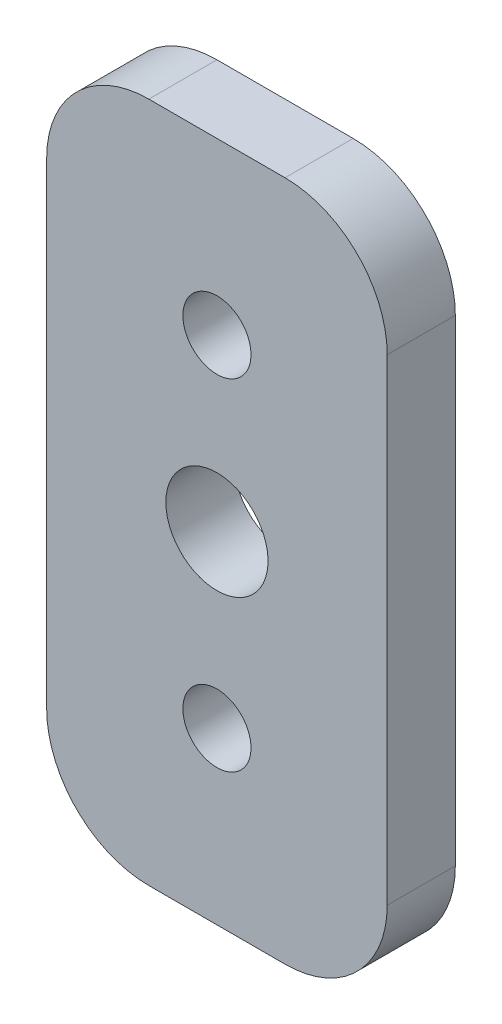
ISO-10303-21;
HEADER;
FILE_DESCRIPTION(('STEP AP214'),'2;1');
FILE_NAME('part.step','',(''),(''),'','','');
FILE_SCHEMA(('AUTOMOTIVE_DESIGN { 1 0 10303 214 1 1 1 1 }'));
ENDSEC;
DATA;
#1=APPLICATION_CONTEXT('core data for automotive mechanical design processes');
#2=APPLICATION_PROTOCOL_DEFINITION('international standard','automotive_design',2000,#1);
#3=PRODUCT_CONTEXT('',#1,'mechanical');
#4=PRODUCT('Part','Part','',(#3));
#5=PRODUCT_RELATED_PRODUCT_CATEGORY('part','',(#4));
#6=PRODUCT_DEFINITION_FORMATION('','',#4);
#7=PRODUCT_DEFINITION_CONTEXT('part definition',#1,'design');
#8=PRODUCT_DEFINITION('design','',#6,#7);
#9=PRODUCT_DEFINITION_SHAPE('','',#8);
#10=(LENGTH_UNIT() NAMED_UNIT(*) SI_UNIT(.MILLI.,.METRE.));
#11=(NAMED_UNIT(*) PLANE_ANGLE_UNIT() SI_UNIT($,.RADIAN.));
#12=(NAMED_UNIT(*) SI_UNIT($,.STERADIAN.) SOLID_ANGLE_UNIT());
#13=UNCERTAINTY_MEASURE_WITH_UNIT(LENGTH_MEASURE(1.E-05),#10,'distance_accuracy_value','');
#14=(GEOMETRIC_REPRESENTATION_CONTEXT(3) GLOBAL_UNCERTAINTY_ASSIGNED_CONTEXT((#13)) GLOBAL_UNIT_ASSIGNED_CONTEXT((#10,
#11,#12)) REPRESENTATION_CONTEXT('',''));
#15=CARTESIAN_POINT('',(0.,0.,0.));
#16=DIRECTION('',(0.,0.,1.));
#17=DIRECTION('',(1.,0.,0.));
#18=AXIS2_PLACEMENT_3D('',#15,#16,#17);
#19=CARTESIAN_POINT('',(-25.,-50.,10.));
#20=DIRECTION('',(1.,0.,0.));
#21=DIRECTION('',(0.,0.,-1.));
#22=AXIS2_PLACEMENT_3D('',#19,#20,#21);
#23=PLANE('',#22);
#24=DIRECTION('',(0.,-1.,0.));
#25=VECTOR('',#24,1.);
#26=CARTESIAN_POINT('',(-25.,-50.,0.));
#27=LINE('',#26,#25);
#28=CARTESIAN_POINT('',(-25.,35.,0.));
#29=VERTEX_POINT('',#28);
#30=CARTESIAN_POINT('',(-25.,-35.,0.));
#31=VERTEX_POINT('',#30);
#32=EDGE_CURVE('E136',#29,#31,#27,.T.);
#33=ORIENTED_EDGE('',*,*,#32,.T.);
#34=DIRECTION('',(0.,0.,-1.));
#35=VECTOR('',#34,1.);
#36=CARTESIAN_POINT('',(-25.,-35.,10.));
#37=LINE('',#36,#35);
#38=CARTESIAN_POINT('',(-25.,-35.,10.));
#39=VERTEX_POINT('',#38);
#40=EDGE_CURVE('E111',#31,#39,#37,.F.);
#41=ORIENTED_EDGE('',*,*,#40,.T.);
#42=DIRECTION('',(0.,-1.,0.));
#43=VECTOR('',#42,1.);
#44=CARTESIAN_POINT('',(-25.,-50.,10.));
#45=LINE('',#44,#43);
#46=CARTESIAN_POINT('',(-25.,35.,10.));
#47=VERTEX_POINT('',#46);
#48=EDGE_CURVE('E149',#47,#39,#45,.T.);
#49=ORIENTED_EDGE('',*,*,#48,.F.);
#50=DIRECTION('',(0.,0.,-1.));
#51=VECTOR('',#50,1.);
#52=CARTESIAN_POINT('',(-25.,35.,10.));
#53=LINE('',#52,#51);
#54=EDGE_CURVE('E117',#47,#29,#53,.T.);
#55=ORIENTED_EDGE('',*,*,#54,.T.);
#56=EDGE_LOOP('',(#33,#41,#49,#55));
#57=FACE_BOUND('',#56,.T.);
#58=ADVANCED_FACE('F39',(#57),#23,.F.);
#59=CARTESIAN_POINT('',(-25.,-50.,10.));
#60=DIRECTION('',(0.,1.,0.));
#61=DIRECTION('',(0.,0.,1.));
#62=AXIS2_PLACEMENT_3D('',#59,#60,#61);
#63=PLANE('',#62);
#64=DIRECTION('',(1.,0.,0.));
#65=VECTOR('',#64,1.);
#66=CARTESIAN_POINT('',(-25.,-50.,10.));
#67=LINE('',#66,#65);
#68=CARTESIAN_POINT('',(-10.,-50.,10.));
#69=VERTEX_POINT('',#68);
#70=CARTESIAN_POINT('',(10.,-50.,10.));
#71=VERTEX_POINT('',#70);
#72=EDGE_CURVE('E127',#69,#71,#67,.T.);
#73=ORIENTED_EDGE('',*,*,#72,.F.);
#74=DIRECTION('',(0.,0.,-1.));
#75=VECTOR('',#74,1.);
#76=CARTESIAN_POINT('',(-10.,-50.,10.));
#77=LINE('',#76,#75);
#78=CARTESIAN_POINT('',(-10.,-50.,0.));
#79=VERTEX_POINT('',#78);
#80=EDGE_CURVE('E110',#69,#79,#77,.T.);
#81=ORIENTED_EDGE('',*,*,#80,.T.);
#82=DIRECTION('',(1.,0.,0.));
#83=VECTOR('',#82,1.);
#84=CARTESIAN_POINT('',(-25.,-50.,0.));
#85=LINE('',#84,#83);
#86=CARTESIAN_POINT('',(10.,-50.,0.));
#87=VERTEX_POINT('',#86);
#88=EDGE_CURVE('E124',#79,#87,#85,.T.);
#89=ORIENTED_EDGE('',*,*,#88,.T.);
#90=DIRECTION('',(0.,0.,-1.));
#91=VECTOR('',#90,1.);
#92=CARTESIAN_POINT('',(10.,-50.,10.));
#93=LINE('',#92,#91);
#94=EDGE_CURVE('E130',#87,#71,#93,.F.);
#95=ORIENTED_EDGE('',*,*,#94,.T.);
#96=EDGE_LOOP('',(#73,#81,#89,#95));
#97=FACE_BOUND('',#96,.T.);
#98=ADVANCED_FACE('F123',(#97),#63,.F.);
#99=CARTESIAN_POINT('',(25.,-50.,10.));
#100=DIRECTION('',(-1.,0.,0.));
#101=DIRECTION('',(0.,0.,1.));
#102=AXIS2_PLACEMENT_3D('',#99,#100,#101);
#103=PLANE('',#102);
#104=DIRECTION('',(0.,1.,0.));
#105=VECTOR('',#104,1.);
#106=CARTESIAN_POINT('',(25.,-50.,0.));
#107=LINE('',#106,#105);
#108=CARTESIAN_POINT('',(25.,-35.,0.));
#109=VERTEX_POINT('',#108);
#110=CARTESIAN_POINT('',(25.,35.,0.));
#111=VERTEX_POINT('',#110);
#112=EDGE_CURVE('E135',#109,#111,#107,.T.);
#113=ORIENTED_EDGE('',*,*,#112,.T.);
#114=DIRECTION('',(0.,0.,-1.));
#115=VECTOR('',#114,1.);
#116=CARTESIAN_POINT('',(25.,35.,10.));
#117=LINE('',#116,#115);
#118=CARTESIAN_POINT('',(25.,35.,10.));
#119=VERTEX_POINT('',#118);
#120=EDGE_CURVE('E11',#111,#119,#117,.F.);
#121=ORIENTED_EDGE('',*,*,#120,.T.);
#122=DIRECTION('',(0.,1.,0.));
#123=VECTOR('',#122,1.);
#124=CARTESIAN_POINT('',(25.,-50.,10.));
#125=LINE('',#124,#123);
#126=CARTESIAN_POINT('',(25.,-35.,10.));
#127=VERTEX_POINT('',#126);
#128=EDGE_CURVE('E188',#127,#119,#125,.T.);
#129=ORIENTED_EDGE('',*,*,#128,.F.);
#130=DIRECTION('',(0.,0.,-1.));
#131=VECTOR('',#130,1.);
#132=CARTESIAN_POINT('',(25.,-35.,10.));
#133=LINE('',#132,#131);
#134=EDGE_CURVE('E48',#127,#109,#133,.T.);
#135=ORIENTED_EDGE('',*,*,#134,.T.);
#136=EDGE_LOOP('',(#113,#121,#129,#135));
#137=FACE_BOUND('',#136,.T.);
#138=ADVANCED_FACE('F186',(#137),#103,.F.);
#139=CARTESIAN_POINT('',(-25.,50.,10.));
#140=DIRECTION('',(0.,-1.,0.));
#141=DIRECTION('',(0.,0.,-1.));
#142=AXIS2_PLACEMENT_3D('',#139,#140,#141);
#143=PLANE('',#142);
#144=DIRECTION('',(-1.,0.,0.));
#145=VECTOR('',#144,1.);
#146=CARTESIAN_POINT('',(-25.,50.,0.));
#147=LINE('',#146,#145);
#148=CARTESIAN_POINT('',(10.,50.,0.));
#149=VERTEX_POINT('',#148);
#150=CARTESIAN_POINT('',(-10.,50.,0.));
#151=VERTEX_POINT('',#150);
#152=EDGE_CURVE('E141',#149,#151,#147,.T.);
#153=ORIENTED_EDGE('',*,*,#152,.T.);
#154=DIRECTION('',(0.,0.,-1.));
#155=VECTOR('',#154,1.);
#156=CARTESIAN_POINT('',(-10.,50.,10.));
#157=LINE('',#156,#155);
#158=CARTESIAN_POINT('',(-10.,50.,10.));
#159=VERTEX_POINT('',#158);
#160=EDGE_CURVE('E55',#151,#159,#157,.F.);
#161=ORIENTED_EDGE('',*,*,#160,.T.);
#162=DIRECTION('',(-1.,0.,0.));
#163=VECTOR('',#162,1.);
#164=CARTESIAN_POINT('',(-25.,50.,10.));
#165=LINE('',#164,#163);
#166=CARTESIAN_POINT('',(10.,50.,10.));
#167=VERTEX_POINT('',#166);
#168=EDGE_CURVE('E151',#167,#159,#165,.T.);
#169=ORIENTED_EDGE('',*,*,#168,.F.);
#170=DIRECTION('',(0.,0.,-1.));
#171=VECTOR('',#170,1.);
#172=CARTESIAN_POINT('',(10.,50.,10.));
#173=LINE('',#172,#171);
#174=EDGE_CURVE('E176',#167,#149,#173,.T.);
#175=ORIENTED_EDGE('',*,*,#174,.T.);
#176=EDGE_LOOP('',(#153,#161,#169,#175));
#177=FACE_BOUND('',#176,.T.);
#178=ADVANCED_FACE('F195',(#177),#143,.F.);
#179=CARTESIAN_POINT('',(0.,0.,10.));
#180=DIRECTION('',(0.,0.,-1.));
#181=DIRECTION('',(-1.,0.,0.));
#182=AXIS2_PLACEMENT_3D('',#179,#180,#181);
#183=PLANE('',#182);
#184=CARTESIAN_POINT('',(0.,-25.,10.));
#185=DIRECTION('',(0.,0.,-1.));
#186=DIRECTION('',(-1.,0.,0.));
#187=AXIS2_PLACEMENT_3D('',#184,#185,#186);
#188=CIRCLE('',#187,5.);
#189=CARTESIAN_POINT('',(-5.,-25.,10.));
#190=VERTEX_POINT('',#189);
#191=EDGE_CURVE('E143',#190,#190,#188,.T.);
#192=ORIENTED_EDGE('',*,*,#191,.T.);
#193=EDGE_LOOP('',(#192));
#194=FACE_BOUND('',#193,.T.);
#195=CARTESIAN_POINT('',(0.,25.,10.));
#196=DIRECTION('',(0.,0.,-1.));
#197=DIRECTION('',(-1.,0.,0.));
#198=AXIS2_PLACEMENT_3D('',#195,#196,#197);
#199=CIRCLE('',#198,5.);
#200=CARTESIAN_POINT('',(-5.,25.,10.));
#201=VERTEX_POINT('',#200);
#202=EDGE_CURVE('E218',#201,#201,#199,.T.);
#203=ORIENTED_EDGE('',*,*,#202,.T.);
#204=EDGE_LOOP('',(#203));
#205=FACE_BOUND('',#204,.T.);
#206=CARTESIAN_POINT('',(0.,0.,10.));
#207=DIRECTION('',(0.,0.,-1.));
#208=DIRECTION('',(-1.,0.,0.));
#209=AXIS2_PLACEMENT_3D('',#206,#207,#208);
#210=CIRCLE('',#209,7.5);
#211=CARTESIAN_POINT('',(-7.5,0.,10.));
#212=VERTEX_POINT('',#211);
#213=EDGE_CURVE('E210',#212,#212,#210,.T.);
#214=ORIENTED_EDGE('',*,*,#213,.T.);
#215=EDGE_LOOP('',(#214));
#216=FACE_BOUND('',#215,.T.);
#217=ORIENTED_EDGE('',*,*,#48,.T.);
#218=CARTESIAN_POINT('',(-10.,-35.,10.));
#219=DIRECTION('',(0.,0.,-1.));
#220=DIRECTION('',(-1.,0.,0.));
#221=AXIS2_PLACEMENT_3D('',#218,#219,#220);
#222=CIRCLE('',#221,15.);
#223=EDGE_CURVE('E173',#39,#69,#222,.F.);
#224=ORIENTED_EDGE('',*,*,#223,.T.);
#225=ORIENTED_EDGE('',*,*,#72,.T.);
#226=CARTESIAN_POINT('',(10.,-35.,10.));
#227=DIRECTION('',(0.,0.,-1.));
#228=DIRECTION('',(-1.,0.,0.));
#229=AXIS2_PLACEMENT_3D('',#226,#227,#228);
#230=CIRCLE('',#229,15.);
#231=EDGE_CURVE('E165',#71,#127,#230,.F.);
#232=ORIENTED_EDGE('',*,*,#231,.T.);
#233=ORIENTED_EDGE('',*,*,#128,.T.);
#234=CARTESIAN_POINT('',(10.,35.,10.));
#235=DIRECTION('',(0.,0.,-1.));
#236=DIRECTION('',(-1.,0.,0.));
#237=AXIS2_PLACEMENT_3D('',#234,#235,#236);
#238=CIRCLE('',#237,15.);
#239=EDGE_CURVE('E62',#119,#167,#238,.F.);
#240=ORIENTED_EDGE('',*,*,#239,.T.);
#241=ORIENTED_EDGE('',*,*,#168,.T.);
#242=CARTESIAN_POINT('',(-10.,35.,10.));
#243=DIRECTION('',(0.,0.,-1.));
#244=DIRECTION('',(-1.,0.,0.));
#245=AXIS2_PLACEMENT_3D('',#242,#243,#244);
#246=CIRCLE('',#245,15.);
#247=EDGE_CURVE('E170',#159,#47,#246,.F.);
#248=ORIENTED_EDGE('',*,*,#247,.T.);
#249=EDGE_LOOP('',(#217,#224,#225,#232,#233,#240,#241,#248));
#250=FACE_BOUND('',#249,.T.);
#251=ADVANCED_FACE('F230',(#194,#205,#216,#250),#183,.F.);
#252=CARTESIAN_POINT('',(0.,0.,0.));
#253=DIRECTION('',(0.,0.,-1.));
#254=DIRECTION('',(-1.,0.,0.));
#255=AXIS2_PLACEMENT_3D('',#252,#253,#254);
#256=PLANE('',#255);
#257=CARTESIAN_POINT('',(0.,-25.,0.));
#258=DIRECTION('',(0.,0.,-1.));
#259=DIRECTION('',(-1.,0.,0.));
#260=AXIS2_PLACEMENT_3D('',#257,#258,#259);
#261=CIRCLE('',#260,5.);
#262=CARTESIAN_POINT('',(-5.,-25.,0.));
#263=VERTEX_POINT('',#262);
#264=EDGE_CURVE('E222',#263,#263,#261,.T.);
#265=ORIENTED_EDGE('',*,*,#264,.F.);
#266=EDGE_LOOP('',(#265));
#267=FACE_BOUND('',#266,.T.);
#268=CARTESIAN_POINT('',(0.,25.,0.));
#269=DIRECTION('',(0.,0.,-1.));
#270=DIRECTION('',(-1.,0.,0.));
#271=AXIS2_PLACEMENT_3D('',#268,#269,#270);
#272=CIRCLE('',#271,5.);
#273=CARTESIAN_POINT('',(-5.,25.,0.));
#274=VERTEX_POINT('',#273);
#275=EDGE_CURVE('E214',#274,#274,#272,.T.);
#276=ORIENTED_EDGE('',*,*,#275,.F.);
#277=EDGE_LOOP('',(#276));
#278=FACE_BOUND('',#277,.T.);
#279=CARTESIAN_POINT('',(0.,0.,0.));
#280=DIRECTION('',(0.,0.,-1.));
#281=DIRECTION('',(-1.,0.,0.));
#282=AXIS2_PLACEMENT_3D('',#279,#280,#281);
#283=CIRCLE('',#282,7.5);
#284=CARTESIAN_POINT('',(-7.5,0.,0.));
#285=VERTEX_POINT('',#284);
#286=EDGE_CURVE('E206',#285,#285,#283,.T.);
#287=ORIENTED_EDGE('',*,*,#286,.F.);
#288=EDGE_LOOP('',(#287));
#289=FACE_BOUND('',#288,.T.);
#290=ORIENTED_EDGE('',*,*,#88,.F.);
#291=CARTESIAN_POINT('',(-10.,-35.,0.));
#292=DIRECTION('',(0.,0.,-1.));
#293=DIRECTION('',(-1.,0.,0.));
#294=AXIS2_PLACEMENT_3D('',#291,#292,#293);
#295=CIRCLE('',#294,15.);
#296=EDGE_CURVE('E106',#79,#31,#295,.T.);
#297=ORIENTED_EDGE('',*,*,#296,.T.);
#298=ORIENTED_EDGE('',*,*,#32,.F.);
#299=CARTESIAN_POINT('',(-10.,35.,0.));
#300=DIRECTION('',(0.,0.,-1.));
#301=DIRECTION('',(-1.,0.,0.));
#302=AXIS2_PLACEMENT_3D('',#299,#300,#301);
#303=CIRCLE('',#302,15.);
#304=EDGE_CURVE('E118',#29,#151,#303,.T.);
#305=ORIENTED_EDGE('',*,*,#304,.T.);
#306=ORIENTED_EDGE('',*,*,#152,.F.);
#307=CARTESIAN_POINT('',(10.,35.,0.));
#308=DIRECTION('',(0.,0.,-1.));
#309=DIRECTION('',(-1.,0.,0.));
#310=AXIS2_PLACEMENT_3D('',#307,#308,#309);
#311=CIRCLE('',#310,15.);
#312=EDGE_CURVE('E155',#149,#111,#311,.T.);
#313=ORIENTED_EDGE('',*,*,#312,.T.);
#314=ORIENTED_EDGE('',*,*,#112,.F.);
#315=CARTESIAN_POINT('',(10.,-35.,0.));
#316=DIRECTION('',(0.,0.,-1.));
#317=DIRECTION('',(-1.,0.,0.));
#318=AXIS2_PLACEMENT_3D('',#315,#316,#317);
#319=CIRCLE('',#318,15.);
#320=EDGE_CURVE('E129',#109,#87,#319,.T.);
#321=ORIENTED_EDGE('',*,*,#320,.T.);
#322=EDGE_LOOP('',(#290,#297,#298,#305,#306,#313,#314,#321));
#323=FACE_BOUND('',#322,.T.);
#324=ADVANCED_FACE('F132',(#267,#278,#289,#323),#256,.T.);
#325=CARTESIAN_POINT('',(-10.,-35.,10.));
#326=DIRECTION('',(0.,0.,-1.));
#327=DIRECTION('',(-1.,0.,0.));
#328=AXIS2_PLACEMENT_3D('',#325,#326,#327);
#329=CYLINDRICAL_SURFACE('',#328,15.);
#330=ORIENTED_EDGE('',*,*,#223,.F.);
#331=ORIENTED_EDGE('',*,*,#40,.F.);
#332=ORIENTED_EDGE('',*,*,#296,.F.);
#333=ORIENTED_EDGE('',*,*,#80,.F.);
#334=EDGE_LOOP('',(#330,#331,#332,#333));
#335=FACE_BOUND('',#334,.T.);
#336=ADVANCED_FACE('F109',(#335),#329,.T.);
#337=CARTESIAN_POINT('',(-10.,35.,10.));
#338=DIRECTION('',(0.,0.,-1.));
#339=DIRECTION('',(-1.,0.,0.));
#340=AXIS2_PLACEMENT_3D('',#337,#338,#339);
#341=CYLINDRICAL_SURFACE('',#340,15.);
#342=ORIENTED_EDGE('',*,*,#247,.F.);
#343=ORIENTED_EDGE('',*,*,#160,.F.);
#344=ORIENTED_EDGE('',*,*,#304,.F.);
#345=ORIENTED_EDGE('',*,*,#54,.F.);
#346=EDGE_LOOP('',(#342,#343,#344,#345));
#347=FACE_BOUND('',#346,.T.);
#348=ADVANCED_FACE('F270',(#347),#341,.T.);
#349=CARTESIAN_POINT('',(10.,35.,10.));
#350=DIRECTION('',(0.,0.,-1.));
#351=DIRECTION('',(-1.,0.,0.));
#352=AXIS2_PLACEMENT_3D('',#349,#350,#351);
#353=CYLINDRICAL_SURFACE('',#352,15.);
#354=ORIENTED_EDGE('',*,*,#239,.F.);
#355=ORIENTED_EDGE('',*,*,#120,.F.);
#356=ORIENTED_EDGE('',*,*,#312,.F.);
#357=ORIENTED_EDGE('',*,*,#174,.F.);
#358=EDGE_LOOP('',(#354,#355,#356,#357));
#359=FACE_BOUND('',#358,.T.);
#360=ADVANCED_FACE('F194',(#359),#353,.T.);
#361=CARTESIAN_POINT('',(10.,-35.,10.));
#362=DIRECTION('',(0.,0.,-1.));
#363=DIRECTION('',(-1.,0.,0.));
#364=AXIS2_PLACEMENT_3D('',#361,#362,#363);
#365=CYLINDRICAL_SURFACE('',#364,15.);
#366=ORIENTED_EDGE('',*,*,#231,.F.);
#367=ORIENTED_EDGE('',*,*,#94,.F.);
#368=ORIENTED_EDGE('',*,*,#320,.F.);
#369=ORIENTED_EDGE('',*,*,#134,.F.);
#370=EDGE_LOOP('',(#366,#367,#368,#369));
#371=FACE_BOUND('',#370,.T.);
#372=ADVANCED_FACE('F41',(#371),#365,.T.);
#373=CARTESIAN_POINT('',(0.,0.,10.));
#374=DIRECTION('',(0.,0.,-1.));
#375=DIRECTION('',(-1.,0.,0.));
#376=AXIS2_PLACEMENT_3D('',#373,#374,#375);
#377=CYLINDRICAL_SURFACE('',#376,7.5);
#378=ORIENTED_EDGE('',*,*,#213,.F.);
#379=EDGE_LOOP('',(#378));
#380=FACE_BOUND('',#379,.T.);
#381=ORIENTED_EDGE('',*,*,#286,.T.);
#382=EDGE_LOOP('',(#381));
#383=FACE_BOUND('',#382,.T.);
#384=ADVANCED_FACE('F247',(#380,#383),#377,.F.);
#385=CARTESIAN_POINT('',(0.,25.,10.));
#386=DIRECTION('',(0.,0.,-1.));
#387=DIRECTION('',(-1.,0.,0.));
#388=AXIS2_PLACEMENT_3D('',#385,#386,#387);
#389=CYLINDRICAL_SURFACE('',#388,5.);
#390=ORIENTED_EDGE('',*,*,#202,.F.);
#391=EDGE_LOOP('',(#390));
#392=FACE_BOUND('',#391,.T.);
#393=ORIENTED_EDGE('',*,*,#275,.T.);
#394=EDGE_LOOP('',(#393));
#395=FACE_BOUND('',#394,.T.);
#396=ADVANCED_FACE('F236',(#392,#395),#389,.F.);
#397=CARTESIAN_POINT('',(0.,-25.,10.));
#398=DIRECTION('',(0.,0.,-1.));
#399=DIRECTION('',(-1.,0.,0.));
#400=AXIS2_PLACEMENT_3D('',#397,#398,#399);
#401=CYLINDRICAL_SURFACE('',#400,5.);
#402=ORIENTED_EDGE('',*,*,#191,.F.);
#403=EDGE_LOOP('',(#402));
#404=FACE_BOUND('',#403,.T.);
#405=ORIENTED_EDGE('',*,*,#264,.T.);
#406=EDGE_LOOP('',(#405));
#407=FACE_BOUND('',#406,.T.);
#408=ADVANCED_FACE('F233',(#404,#407),#401,.F.);
#409=CLOSED_SHELL('',(#58,#98,#138,#178,#251,#324,#336,#348,#360,#372,#384,#396,#408));
#410=MANIFOLD_SOLID_BREP('B2',#409);
#411=ADVANCED_BREP_SHAPE_REPRESENTATION('',(#18,#410),#14);
#412=SHAPE_DEFINITION_REPRESENTATION(#9,#411);
ENDSEC;
END-ISO-10303-21;
